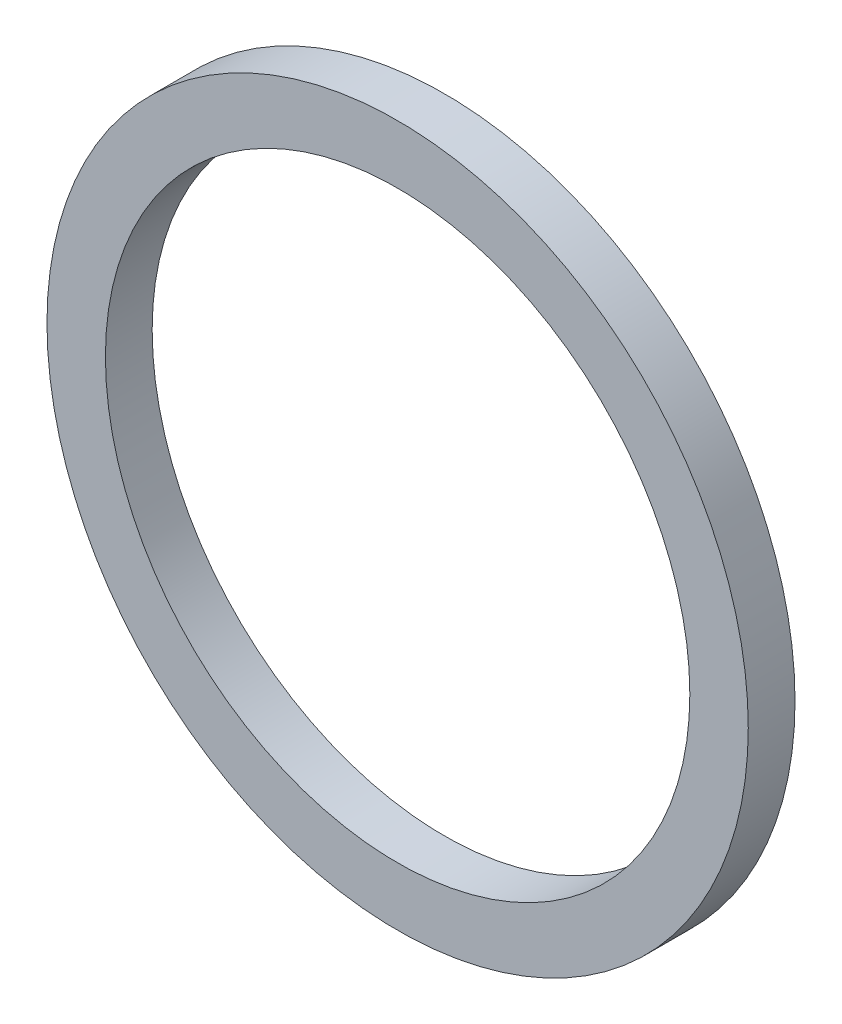
ISO-10303-21;
HEADER;
FILE_DESCRIPTION(('STEP AP214'),'2;1');
FILE_NAME('part.step','',(''),(''),'','','');
FILE_SCHEMA(('AUTOMOTIVE_DESIGN { 1 0 10303 214 1 1 1 1 }'));
ENDSEC;
DATA;
#1=APPLICATION_CONTEXT('core data for automotive mechanical design processes');
#2=APPLICATION_PROTOCOL_DEFINITION('international standard','automotive_design',2000,#1);
#3=PRODUCT_CONTEXT('',#1,'mechanical');
#4=PRODUCT('Part','Part','',(#3));
#5=PRODUCT_RELATED_PRODUCT_CATEGORY('part','',(#4));
#6=PRODUCT_DEFINITION_FORMATION('','',#4);
#7=PRODUCT_DEFINITION_CONTEXT('part definition',#1,'design');
#8=PRODUCT_DEFINITION('design','',#6,#7);
#9=PRODUCT_DEFINITION_SHAPE('','',#8);
#10=(LENGTH_UNIT() NAMED_UNIT(*) SI_UNIT(.MILLI.,.METRE.));
#11=(NAMED_UNIT(*) PLANE_ANGLE_UNIT() SI_UNIT($,.RADIAN.));
#12=(NAMED_UNIT(*) SI_UNIT($,.STERADIAN.) SOLID_ANGLE_UNIT());
#13=UNCERTAINTY_MEASURE_WITH_UNIT(LENGTH_MEASURE(1.E-05),#10,'distance_accuracy_value','');
#14=(GEOMETRIC_REPRESENTATION_CONTEXT(3) GLOBAL_UNCERTAINTY_ASSIGNED_CONTEXT((#13)) GLOBAL_UNIT_ASSIGNED_CONTEXT((#10,
#11,#12)) REPRESENTATION_CONTEXT('',''));
#15=CARTESIAN_POINT('',(0.,0.,0.));
#16=DIRECTION('',(0.,0.,1.));
#17=DIRECTION('',(1.,0.,0.));
#18=AXIS2_PLACEMENT_3D('',#15,#16,#17);
#19=CARTESIAN_POINT('',(0.,0.,0.8));
#20=DIRECTION('',(0.,0.,1.));
#21=DIRECTION('',(1.,0.,0.));
#22=AXIS2_PLACEMENT_3D('',#19,#20,#21);
#23=PLANE('',#22);
#24=CARTESIAN_POINT('',(0.,0.,0.8));
#25=DIRECTION('',(0.,0.,1.));
#26=DIRECTION('',(1.,0.,0.));
#27=AXIS2_PLACEMENT_3D('',#24,#25,#26);
#28=CIRCLE('',#27,6.);
#29=CARTESIAN_POINT('',(6.,0.,0.8));
#30=VERTEX_POINT('',#29);
#31=EDGE_CURVE('E10',#30,#30,#28,.T.);
#32=ORIENTED_EDGE('',*,*,#31,.T.);
#33=EDGE_LOOP('',(#32));
#34=FACE_BOUND('',#33,.T.);
#35=CARTESIAN_POINT('',(0.,0.,0.8));
#36=DIRECTION('',(0.,0.,1.));
#37=DIRECTION('',(1.,0.,0.));
#38=AXIS2_PLACEMENT_3D('',#35,#36,#37);
#39=CIRCLE('',#38,5.);
#40=CARTESIAN_POINT('',(5.,0.,0.8));
#41=VERTEX_POINT('',#40);
#42=EDGE_CURVE('E41',#41,#41,#39,.T.);
#43=ORIENTED_EDGE('',*,*,#42,.F.);
#44=EDGE_LOOP('',(#43));
#45=FACE_BOUND('',#44,.T.);
#46=ADVANCED_FACE('F30',(#34,#45),#23,.T.);
#47=CARTESIAN_POINT('',(0.,0.,0.));
#48=DIRECTION('',(0.,0.,1.));
#49=DIRECTION('',(1.,0.,0.));
#50=AXIS2_PLACEMENT_3D('',#47,#48,#49);
#51=PLANE('',#50);
#52=CARTESIAN_POINT('',(0.,0.,0.));
#53=DIRECTION('',(0.,0.,1.));
#54=DIRECTION('',(1.,0.,0.));
#55=AXIS2_PLACEMENT_3D('',#52,#53,#54);
#56=CIRCLE('',#55,6.);
#57=CARTESIAN_POINT('',(6.,0.,0.));
#58=VERTEX_POINT('',#57);
#59=EDGE_CURVE('E34',#58,#58,#56,.T.);
#60=ORIENTED_EDGE('',*,*,#59,.F.);
#61=EDGE_LOOP('',(#60));
#62=FACE_BOUND('',#61,.T.);
#63=CARTESIAN_POINT('',(0.,0.,0.));
#64=DIRECTION('',(0.,0.,1.));
#65=DIRECTION('',(1.,0.,0.));
#66=AXIS2_PLACEMENT_3D('',#63,#64,#65);
#67=CIRCLE('',#66,5.);
#68=CARTESIAN_POINT('',(5.,0.,0.));
#69=VERTEX_POINT('',#68);
#70=EDGE_CURVE('E43',#69,#69,#67,.T.);
#71=ORIENTED_EDGE('',*,*,#70,.T.);
#72=EDGE_LOOP('',(#71));
#73=FACE_BOUND('',#72,.T.);
#74=ADVANCED_FACE('F53',(#62,#73),#51,.F.);
#75=CARTESIAN_POINT('',(0.,0.,0.8));
#76=DIRECTION('',(0.,0.,-1.));
#77=DIRECTION('',(-1.,0.,0.));
#78=AXIS2_PLACEMENT_3D('',#75,#76,#77);
#79=CYLINDRICAL_SURFACE('',#78,6.);
#80=ORIENTED_EDGE('',*,*,#31,.F.);
#81=EDGE_LOOP('',(#80));
#82=FACE_BOUND('',#81,.T.);
#83=ORIENTED_EDGE('',*,*,#59,.T.);
#84=EDGE_LOOP('',(#83));
#85=FACE_BOUND('',#84,.T.);
#86=ADVANCED_FACE('F32',(#82,#85),#79,.T.);
#87=CARTESIAN_POINT('',(0.,0.,0.8));
#88=DIRECTION('',(0.,0.,-1.));
#89=DIRECTION('',(-1.,0.,0.));
#90=AXIS2_PLACEMENT_3D('',#87,#88,#89);
#91=CYLINDRICAL_SURFACE('',#90,5.);
#92=ORIENTED_EDGE('',*,*,#42,.T.);
#93=EDGE_LOOP('',(#92));
#94=FACE_BOUND('',#93,.T.);
#95=ORIENTED_EDGE('',*,*,#70,.F.);
#96=EDGE_LOOP('',(#95));
#97=FACE_BOUND('',#96,.T.);
#98=ADVANCED_FACE('F49',(#94,#97),#91,.F.);
#99=CLOSED_SHELL('',(#46,#74,#86,#98));
#100=MANIFOLD_SOLID_BREP('B2',#99);
#101=ADVANCED_BREP_SHAPE_REPRESENTATION('',(#18,#100),#14);
#102=SHAPE_DEFINITION_REPRESENTATION(#9,#101);
ENDSEC;
END-ISO-10303-21;
